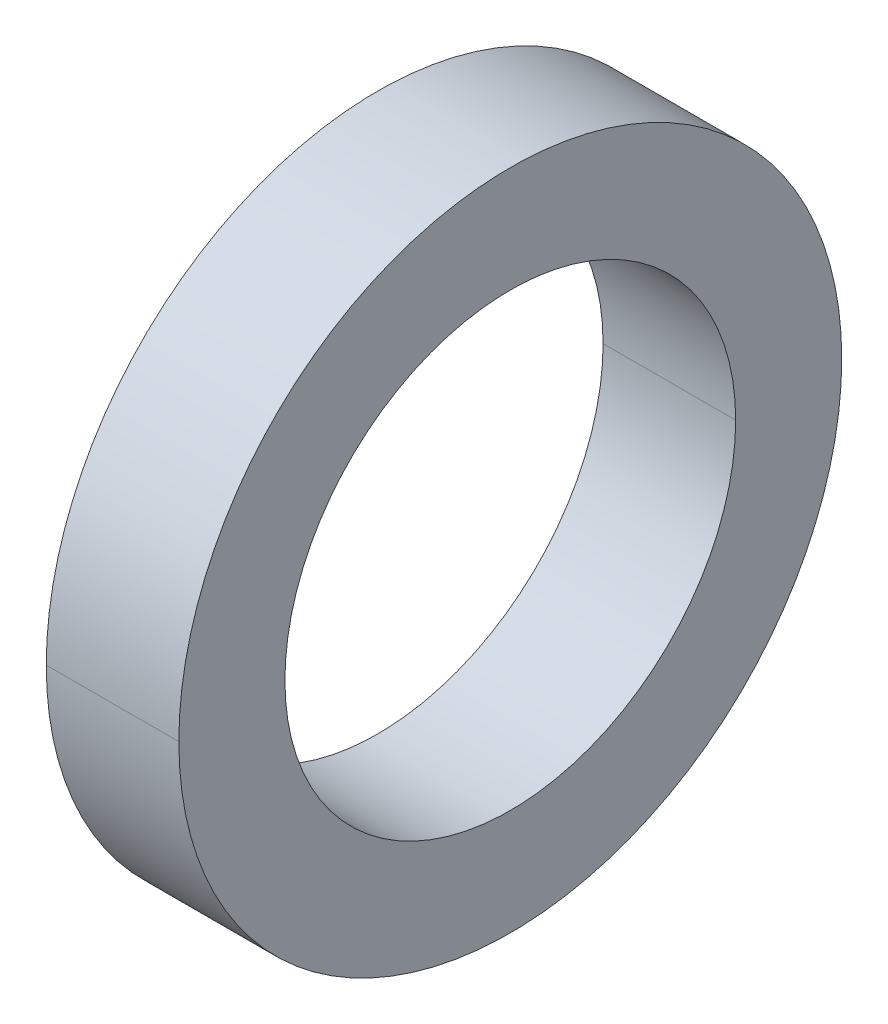
ISO-10303-21;
HEADER;
FILE_DESCRIPTION(('STEP AP214'),'2;1');
FILE_NAME('part.step','',(''),(''),'','','');
FILE_SCHEMA(('AUTOMOTIVE_DESIGN { 1 0 10303 214 1 1 1 1 }'));
ENDSEC;
DATA;
#1=APPLICATION_CONTEXT('core data for automotive mechanical design processes');
#2=APPLICATION_PROTOCOL_DEFINITION('international standard','automotive_design',2000,#1);
#3=PRODUCT_CONTEXT('',#1,'mechanical');
#4=PRODUCT('Part','Part','',(#3));
#5=PRODUCT_RELATED_PRODUCT_CATEGORY('part','',(#4));
#6=PRODUCT_DEFINITION_FORMATION('','',#4);
#7=PRODUCT_DEFINITION_CONTEXT('part definition',#1,'design');
#8=PRODUCT_DEFINITION('design','',#6,#7);
#9=PRODUCT_DEFINITION_SHAPE('','',#8);
#10=(LENGTH_UNIT() NAMED_UNIT(*) SI_UNIT(.MILLI.,.METRE.));
#11=(NAMED_UNIT(*) PLANE_ANGLE_UNIT() SI_UNIT($,.RADIAN.));
#12=(NAMED_UNIT(*) SI_UNIT($,.STERADIAN.) SOLID_ANGLE_UNIT());
#13=UNCERTAINTY_MEASURE_WITH_UNIT(LENGTH_MEASURE(1.E-05),#10,'distance_accuracy_value','');
#14=(GEOMETRIC_REPRESENTATION_CONTEXT(3) GLOBAL_UNCERTAINTY_ASSIGNED_CONTEXT((#13)) GLOBAL_UNIT_ASSIGNED_CONTEXT((#10,
#11,#12)) REPRESENTATION_CONTEXT('',''));
#15=CARTESIAN_POINT('',(0.,0.,0.));
#16=DIRECTION('',(0.,0.,1.));
#17=DIRECTION('',(1.,0.,0.));
#18=AXIS2_PLACEMENT_3D('',#15,#16,#17);
#19=CARTESIAN_POINT('',(0.,0.,0.));
#20=DIRECTION('',(1.,0.,0.));
#21=DIRECTION('',(0.,0.,-1.));
#22=AXIS2_PLACEMENT_3D('',#19,#20,#21);
#23=CYLINDRICAL_SURFACE('',#22,12.5);
#24=CARTESIAN_POINT('',(-24.5,0.,0.));
#25=DIRECTION('',(1.,0.,0.));
#26=DIRECTION('',(0.,0.,-1.));
#27=AXIS2_PLACEMENT_3D('',#24,#25,#26);
#28=CIRCLE('',#27,12.5);
#29=CARTESIAN_POINT('',(-24.5,0.,-12.5));
#30=VERTEX_POINT('',#29);
#31=CARTESIAN_POINT('',(-24.5,0.,12.5));
#32=VERTEX_POINT('',#31);
#33=EDGE_CURVE('E27',#30,#32,#28,.T.);
#34=ORIENTED_EDGE('',*,*,#33,.T.);
#35=DIRECTION('',(1.,0.,0.));
#36=VECTOR('',#35,1.);
#37=CARTESIAN_POINT('',(0.,0.,12.5));
#38=LINE('',#37,#36);
#39=CARTESIAN_POINT('',(-19.5,0.,12.5));
#40=VERTEX_POINT('',#39);
#41=EDGE_CURVE('E81',#32,#40,#38,.T.);
#42=ORIENTED_EDGE('',*,*,#41,.T.);
#43=CARTESIAN_POINT('',(-19.5,0.,0.));
#44=DIRECTION('',(1.,0.,0.));
#45=DIRECTION('',(0.,0.,-1.));
#46=AXIS2_PLACEMENT_3D('',#43,#44,#45);
#47=CIRCLE('',#46,12.5);
#48=CARTESIAN_POINT('',(-19.5,0.,-12.5));
#49=VERTEX_POINT('',#48);
#50=EDGE_CURVE('E66',#49,#40,#47,.T.);
#51=ORIENTED_EDGE('',*,*,#50,.F.);
#52=DIRECTION('',(1.,0.,0.));
#53=VECTOR('',#52,1.);
#54=CARTESIAN_POINT('',(0.,0.,-12.5));
#55=LINE('',#54,#53);
#56=EDGE_CURVE('E82',#30,#49,#55,.T.);
#57=ORIENTED_EDGE('',*,*,#56,.F.);
#58=EDGE_LOOP('',(#34,#42,#51,#57));
#59=FACE_BOUND('',#58,.T.);
#60=ADVANCED_FACE('F16',(#59),#23,.T.);
#61=CARTESIAN_POINT('',(0.,0.,0.));
#62=DIRECTION('',(1.,0.,0.));
#63=DIRECTION('',(0.,0.,-1.));
#64=AXIS2_PLACEMENT_3D('',#61,#62,#63);
#65=CYLINDRICAL_SURFACE('',#64,8.5);
#66=CARTESIAN_POINT('',(-24.5,0.,0.));
#67=DIRECTION('',(1.,0.,0.));
#68=DIRECTION('',(0.,0.,-1.));
#69=AXIS2_PLACEMENT_3D('',#66,#67,#68);
#70=CIRCLE('',#69,8.5);
#71=CARTESIAN_POINT('',(-24.5,0.,8.5));
#72=VERTEX_POINT('',#71);
#73=CARTESIAN_POINT('',(-24.5,0.,-8.5));
#74=VERTEX_POINT('',#73);
#75=EDGE_CURVE('E10',#72,#74,#70,.T.);
#76=ORIENTED_EDGE('',*,*,#75,.F.);
#77=DIRECTION('',(1.,0.,0.));
#78=VECTOR('',#77,1.);
#79=CARTESIAN_POINT('',(0.,0.,8.5));
#80=LINE('',#79,#78);
#81=CARTESIAN_POINT('',(-19.5,0.,8.5));
#82=VERTEX_POINT('',#81);
#83=EDGE_CURVE('E104',#72,#82,#80,.T.);
#84=ORIENTED_EDGE('',*,*,#83,.T.);
#85=CARTESIAN_POINT('',(-19.5,0.,0.));
#86=DIRECTION('',(1.,0.,0.));
#87=DIRECTION('',(0.,0.,-1.));
#88=AXIS2_PLACEMENT_3D('',#85,#86,#87);
#89=CIRCLE('',#88,8.5);
#90=CARTESIAN_POINT('',(-19.5,0.,-8.5));
#91=VERTEX_POINT('',#90);
#92=EDGE_CURVE('E100',#82,#91,#89,.T.);
#93=ORIENTED_EDGE('',*,*,#92,.T.);
#94=DIRECTION('',(1.,0.,0.));
#95=VECTOR('',#94,1.);
#96=CARTESIAN_POINT('',(0.,0.,-8.5));
#97=LINE('',#96,#95);
#98=EDGE_CURVE('E20',#74,#91,#97,.T.);
#99=ORIENTED_EDGE('',*,*,#98,.F.);
#100=EDGE_LOOP('',(#76,#84,#93,#99));
#101=FACE_BOUND('',#100,.T.);
#102=ADVANCED_FACE('F18',(#101),#65,.F.);
#103=CARTESIAN_POINT('',(-24.5,12.5,0.));
#104=DIRECTION('',(-1.,0.,0.));
#105=DIRECTION('',(0.,0.,1.));
#106=AXIS2_PLACEMENT_3D('',#103,#104,#105);
#107=PLANE('',#106);
#108=CARTESIAN_POINT('',(-24.5,0.,0.));
#109=DIRECTION('',(1.,0.,0.));
#110=DIRECTION('',(0.,0.,-1.));
#111=AXIS2_PLACEMENT_3D('',#108,#109,#110);
#112=CIRCLE('',#111,8.5);
#113=EDGE_CURVE('E108',#74,#72,#112,.T.);
#114=ORIENTED_EDGE('',*,*,#113,.T.);
#115=ORIENTED_EDGE('',*,*,#75,.T.);
#116=EDGE_LOOP('',(#114,#115));
#117=FACE_BOUND('',#116,.T.);
#118=ORIENTED_EDGE('',*,*,#33,.F.);
#119=CARTESIAN_POINT('',(-24.5,0.,0.));
#120=DIRECTION('',(1.,0.,0.));
#121=DIRECTION('',(0.,0.,-1.));
#122=AXIS2_PLACEMENT_3D('',#119,#120,#121);
#123=CIRCLE('',#122,12.5);
#124=EDGE_CURVE('E87',#32,#30,#123,.T.);
#125=ORIENTED_EDGE('',*,*,#124,.F.);
#126=EDGE_LOOP('',(#118,#125));
#127=FACE_BOUND('',#126,.T.);
#128=ADVANCED_FACE('F134',(#117,#127),#107,.T.);
#129=CARTESIAN_POINT('',(0.,0.,0.));
#130=DIRECTION('',(1.,0.,0.));
#131=DIRECTION('',(0.,0.,-1.));
#132=AXIS2_PLACEMENT_3D('',#129,#130,#131);
#133=CYLINDRICAL_SURFACE('',#132,8.5);
#134=ORIENTED_EDGE('',*,*,#83,.F.);
#135=ORIENTED_EDGE('',*,*,#113,.F.);
#136=ORIENTED_EDGE('',*,*,#98,.T.);
#137=CARTESIAN_POINT('',(-19.5,0.,0.));
#138=DIRECTION('',(1.,0.,0.));
#139=DIRECTION('',(0.,0.,-1.));
#140=AXIS2_PLACEMENT_3D('',#137,#138,#139);
#141=CIRCLE('',#140,8.5);
#142=EDGE_CURVE('E75',#91,#82,#141,.T.);
#143=ORIENTED_EDGE('',*,*,#142,.T.);
#144=EDGE_LOOP('',(#134,#135,#136,#143));
#145=FACE_BOUND('',#144,.T.);
#146=ADVANCED_FACE('F123',(#145),#133,.F.);
#147=CARTESIAN_POINT('',(-19.5,8.5,0.));
#148=DIRECTION('',(1.,0.,0.));
#149=DIRECTION('',(0.,1.,0.));
#150=AXIS2_PLACEMENT_3D('',#147,#148,#149);
#151=PLANE('',#150);
#152=ORIENTED_EDGE('',*,*,#142,.F.);
#153=ORIENTED_EDGE('',*,*,#92,.F.);
#154=EDGE_LOOP('',(#152,#153));
#155=FACE_BOUND('',#154,.T.);
#156=ORIENTED_EDGE('',*,*,#50,.T.);
#157=CARTESIAN_POINT('',(-19.5,0.,0.));
#158=DIRECTION('',(1.,0.,0.));
#159=DIRECTION('',(0.,0.,-1.));
#160=AXIS2_PLACEMENT_3D('',#157,#158,#159);
#161=CIRCLE('',#160,12.5);
#162=EDGE_CURVE('E69',#40,#49,#161,.T.);
#163=ORIENTED_EDGE('',*,*,#162,.T.);
#164=EDGE_LOOP('',(#156,#163));
#165=FACE_BOUND('',#164,.T.);
#166=ADVANCED_FACE('F68',(#155,#165),#151,.T.);
#167=CARTESIAN_POINT('',(0.,0.,0.));
#168=DIRECTION('',(1.,0.,0.));
#169=DIRECTION('',(0.,0.,-1.));
#170=AXIS2_PLACEMENT_3D('',#167,#168,#169);
#171=CYLINDRICAL_SURFACE('',#170,12.5);
#172=ORIENTED_EDGE('',*,*,#41,.F.);
#173=ORIENTED_EDGE('',*,*,#124,.T.);
#174=ORIENTED_EDGE('',*,*,#56,.T.);
#175=ORIENTED_EDGE('',*,*,#162,.F.);
#176=EDGE_LOOP('',(#172,#173,#174,#175));
#177=FACE_BOUND('',#176,.T.);
#178=ADVANCED_FACE('F79',(#177),#171,.T.);
#179=CLOSED_SHELL('',(#60,#102,#128,#146,#166,#178));
#180=MANIFOLD_SOLID_BREP('B1',#179);
#181=ADVANCED_BREP_SHAPE_REPRESENTATION('',(#18,#180),#14);
#182=SHAPE_DEFINITION_REPRESENTATION(#9,#181);
ENDSEC;
END-ISO-10303-21;
